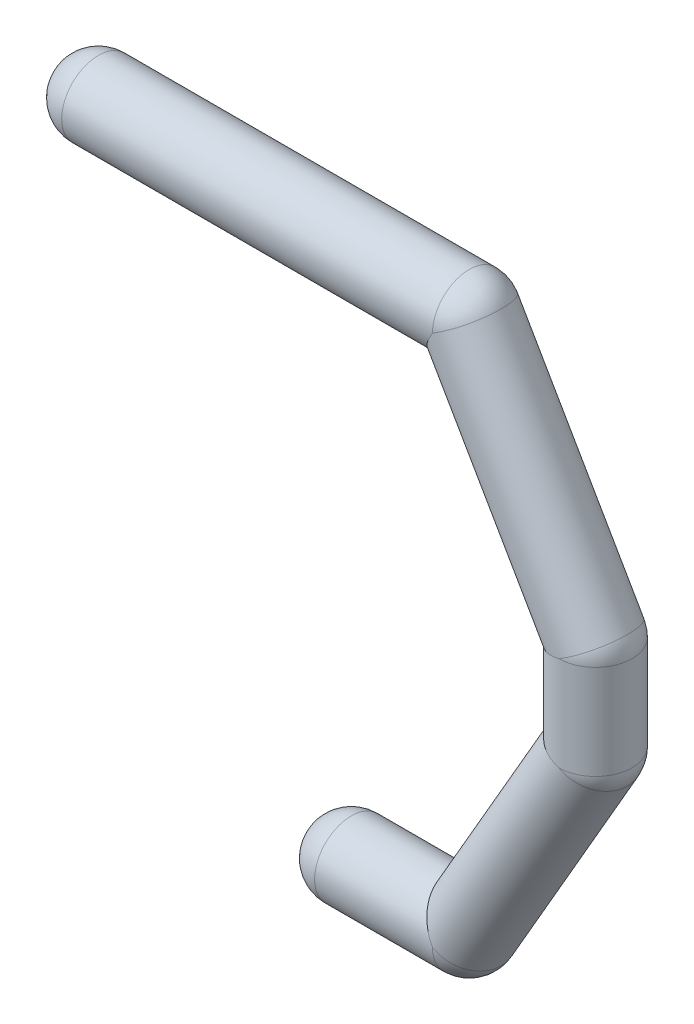
ISO-10303-21;
HEADER;
FILE_DESCRIPTION(('STEP AP214'),'2;1');
FILE_NAME('part.step','',(''),(''),'','','');
FILE_SCHEMA(('AUTOMOTIVE_DESIGN { 1 0 10303 214 1 1 1 1 }'));
ENDSEC;
DATA;
#1=APPLICATION_CONTEXT('core data for automotive mechanical design processes');
#2=APPLICATION_PROTOCOL_DEFINITION('international standard','automotive_design',2000,#1);
#3=PRODUCT_CONTEXT('',#1,'mechanical');
#4=PRODUCT('Part','Part','',(#3));
#5=PRODUCT_RELATED_PRODUCT_CATEGORY('part','',(#4));
#6=PRODUCT_DEFINITION_FORMATION('','',#4);
#7=PRODUCT_DEFINITION_CONTEXT('part definition',#1,'design');
#8=PRODUCT_DEFINITION('design','',#6,#7);
#9=PRODUCT_DEFINITION_SHAPE('','',#8);
#10=(LENGTH_UNIT() NAMED_UNIT(*) SI_UNIT(.MILLI.,.METRE.));
#11=(NAMED_UNIT(*) PLANE_ANGLE_UNIT() SI_UNIT($,.RADIAN.));
#12=(NAMED_UNIT(*) SI_UNIT($,.STERADIAN.) SOLID_ANGLE_UNIT());
#13=UNCERTAINTY_MEASURE_WITH_UNIT(LENGTH_MEASURE(1.E-05),#10,'distance_accuracy_value','');
#14=(GEOMETRIC_REPRESENTATION_CONTEXT(3) GLOBAL_UNCERTAINTY_ASSIGNED_CONTEXT((#13)) GLOBAL_UNIT_ASSIGNED_CONTEXT((#10,
#11,#12)) REPRESENTATION_CONTEXT('',''));
#15=CARTESIAN_POINT('',(0.,0.,0.));
#16=DIRECTION('',(0.,0.,1.));
#17=DIRECTION('',(1.,0.,0.));
#18=AXIS2_PLACEMENT_3D('',#15,#16,#17);
#19=CARTESIAN_POINT('',(20.395,-13.08,1.425));
#20=DIRECTION('',(1.,0.,0.));
#21=DIRECTION('',(0.,-1.,0.));
#22=AXIS2_PLACEMENT_3D('',#19,#20,#21);
#23=SPHERICAL_SURFACE('',#22,0.24);
#24=CARTESIAN_POINT('',(20.395,-13.08,1.425));
#25=DIRECTION('',(-1.,0.,0.));
#26=DIRECTION('',(0.,0.,1.));
#27=AXIS2_PLACEMENT_3D('',#24,#25,#26);
#28=CIRCLE('',#27,0.24);
#29=CARTESIAN_POINT('',(20.395,-13.08,1.665));
#30=VERTEX_POINT('',#29);
#31=EDGE_CURVE('E70',#30,#30,#28,.F.);
#32=ORIENTED_EDGE('',*,*,#31,.F.);
#33=EDGE_LOOP('',(#32));
#34=FACE_BOUND('',#33,.T.);
#35=ADVANCED_FACE('F63',(#34),#23,.T.);
#36=CARTESIAN_POINT('',(21.166,-13.08,1.425));
#37=DIRECTION('',(-1.,0.,0.));
#38=DIRECTION('',(0.,0.,1.));
#39=AXIS2_PLACEMENT_3D('',#36,#37,#38);
#40=CYLINDRICAL_SURFACE('',#39,0.24);
#41=CARTESIAN_POINT('',(21.166,-13.08,1.425));
#42=DIRECTION('',(-0.866000737383216,-0.50004272102664,0.));
#43=DIRECTION('',(-0.500042721026639,0.866000737383216,0.));
#44=AXIS2_PLACEMENT_3D('',#41,#42,#43);
#45=ELLIPSE('',#44,0.277136022684236,0.24);
#46=CARTESIAN_POINT('',(21.166,-13.08,1.185));
#47=VERTEX_POINT('',#46);
#48=CARTESIAN_POINT('',(21.166,-13.08,1.665));
#49=VERTEX_POINT('',#48);
#50=EDGE_CURVE('E12',#47,#49,#45,.F.);
#51=ORIENTED_EDGE('',*,*,#50,.F.);
#52=CARTESIAN_POINT('',(21.166,-13.08,1.425));
#53=DIRECTION('',(-1.,0.,0.));
#54=DIRECTION('',(0.,0.,1.));
#55=AXIS2_PLACEMENT_3D('',#52,#53,#54);
#56=CIRCLE('',#55,0.24);
#57=EDGE_CURVE('E77',#47,#49,#56,.T.);
#58=ORIENTED_EDGE('',*,*,#57,.T.);
#59=EDGE_LOOP('',(#51,#58));
#60=FACE_BOUND('',#59,.T.);
#61=ORIENTED_EDGE('',*,*,#31,.T.);
#62=EDGE_LOOP('',(#61));
#63=FACE_BOUND('',#62,.T.);
#64=ADVANCED_FACE('F137',(#60,#63),#40,.T.);
#65=CARTESIAN_POINT('',(21.166,-13.08,1.425));
#66=DIRECTION('',(1.,0.,0.));
#67=DIRECTION('',(0.,-1.,0.));
#68=AXIS2_PLACEMENT_3D('',#65,#66,#67);
#69=SPHERICAL_SURFACE('',#68,0.24);
#70=ORIENTED_EDGE('',*,*,#57,.F.);
#71=CARTESIAN_POINT('',(21.166,-13.08,1.425));
#72=DIRECTION('',(-0.499914554296549,-0.86607473026436,0.));
#73=DIRECTION('',(0.86607473026436,-0.499914554296549,0.));
#74=AXIS2_PLACEMENT_3D('',#71,#72,#73);
#75=CIRCLE('',#74,0.24);
#76=EDGE_CURVE('E128',#49,#47,#75,.F.);
#77=ORIENTED_EDGE('',*,*,#76,.F.);
#78=EDGE_LOOP('',(#70,#77));
#79=FACE_BOUND('',#78,.T.);
#80=ADVANCED_FACE('F143',(#79),#69,.T.);
#81=CARTESIAN_POINT('',(21.992,-11.649,1.425));
#82=DIRECTION('',(-0.499914554296549,-0.86607473026436,0.));
#83=DIRECTION('',(0.86607473026436,-0.499914554296549,0.));
#84=AXIS2_PLACEMENT_3D('',#81,#82,#83);
#85=CYLINDRICAL_SURFACE('',#84,0.24);
#86=CARTESIAN_POINT('',(21.992,-11.649,1.425));
#87=DIRECTION('',(-0.258771394995313,-0.965938592837132,0.));
#88=DIRECTION('',(-0.965938592837132,0.258771394995313,0.));
#89=AXIS2_PLACEMENT_3D('',#86,#87,#88);
#90=ELLIPSE('',#89,0.248462999387029,0.24);
#91=CARTESIAN_POINT('',(21.992,-11.649,1.185));
#92=VERTEX_POINT('',#91);
#93=CARTESIAN_POINT('',(21.992,-11.649,1.665));
#94=VERTEX_POINT('',#93);
#95=EDGE_CURVE('E131',#92,#94,#90,.F.);
#96=ORIENTED_EDGE('',*,*,#95,.F.);
#97=CARTESIAN_POINT('',(21.992,-11.649,1.425));
#98=DIRECTION('',(-0.499914554296552,-0.866074730264358,0.));
#99=DIRECTION('',(0.866074730264358,-0.499914554296552,0.));
#100=AXIS2_PLACEMENT_3D('',#97,#98,#99);
#101=CIRCLE('',#100,0.24);
#102=EDGE_CURVE('E126',#92,#94,#101,.T.);
#103=ORIENTED_EDGE('',*,*,#102,.T.);
#104=EDGE_LOOP('',(#96,#103));
#105=FACE_BOUND('',#104,.T.);
#106=ORIENTED_EDGE('',*,*,#76,.T.);
#107=ORIENTED_EDGE('',*,*,#50,.T.);
#108=EDGE_LOOP('',(#106,#107));
#109=FACE_BOUND('',#108,.T.);
#110=ADVANCED_FACE('F147',(#105,#109),#85,.T.);
#111=CARTESIAN_POINT('',(21.992,-11.649,1.425));
#112=DIRECTION('',(1.,0.,0.));
#113=DIRECTION('',(0.,-1.,0.));
#114=AXIS2_PLACEMENT_3D('',#111,#112,#113);
#115=SPHERICAL_SURFACE('',#114,0.24);
#116=ORIENTED_EDGE('',*,*,#102,.F.);
#117=CARTESIAN_POINT('',(21.992,-11.649,1.425));
#118=DIRECTION('',(0.,-1.,0.));
#119=DIRECTION('',(0.,0.,-1.));
#120=AXIS2_PLACEMENT_3D('',#117,#118,#119);
#121=CIRCLE('',#120,0.24);
#122=EDGE_CURVE('E116',#94,#92,#121,.F.);
#123=ORIENTED_EDGE('',*,*,#122,.F.);
#124=EDGE_LOOP('',(#116,#123));
#125=FACE_BOUND('',#124,.T.);
#126=ADVANCED_FACE('F153',(#125),#115,.T.);
#127=CARTESIAN_POINT('',(21.992,-11.031,1.425));
#128=DIRECTION('',(0.,-1.,0.));
#129=DIRECTION('',(0.,0.,-1.));
#130=AXIS2_PLACEMENT_3D('',#127,#128,#129);
#131=CYLINDRICAL_SURFACE('',#130,0.240000000000001);
#132=CARTESIAN_POINT('',(21.992,-11.031,1.425));
#133=DIRECTION('',(0.258771394995313,-0.965938592837133,0.));
#134=DIRECTION('',(-0.965938592837133,-0.258771394995312,0.));
#135=AXIS2_PLACEMENT_3D('',#132,#133,#134);
#136=ELLIPSE('',#135,0.248462999387029,0.24);
#137=CARTESIAN_POINT('',(21.992,-11.031,1.185));
#138=VERTEX_POINT('',#137);
#139=CARTESIAN_POINT('',(21.992,-11.031,1.665));
#140=VERTEX_POINT('',#139);
#141=EDGE_CURVE('E123',#138,#140,#136,.F.);
#142=ORIENTED_EDGE('',*,*,#141,.F.);
#143=CARTESIAN_POINT('',(21.992,-11.031,1.425));
#144=DIRECTION('',(0.,-1.,0.));
#145=DIRECTION('',(0.,0.,-1.));
#146=AXIS2_PLACEMENT_3D('',#143,#144,#145);
#147=CIRCLE('',#146,0.240000000000001);
#148=EDGE_CURVE('E114',#138,#140,#147,.T.);
#149=ORIENTED_EDGE('',*,*,#148,.T.);
#150=EDGE_LOOP('',(#142,#149));
#151=FACE_BOUND('',#150,.T.);
#152=ORIENTED_EDGE('',*,*,#122,.T.);
#153=ORIENTED_EDGE('',*,*,#95,.T.);
#154=EDGE_LOOP('',(#152,#153));
#155=FACE_BOUND('',#154,.T.);
#156=ADVANCED_FACE('F157',(#151,#155),#131,.T.);
#157=CARTESIAN_POINT('',(21.992,-11.031,1.425));
#158=DIRECTION('',(1.,0.,0.));
#159=DIRECTION('',(0.,-1.,0.));
#160=AXIS2_PLACEMENT_3D('',#157,#158,#159);
#161=SPHERICAL_SURFACE('',#160,0.24);
#162=ORIENTED_EDGE('',*,*,#148,.F.);
#163=CARTESIAN_POINT('',(21.992,-11.031,1.425));
#164=DIRECTION('',(0.499914554296548,-0.86607473026436,0.));
#165=DIRECTION('',(0.86607473026436,0.499914554296548,0.));
#166=AXIS2_PLACEMENT_3D('',#163,#164,#165);
#167=CIRCLE('',#166,0.24);
#168=EDGE_CURVE('E104',#140,#138,#167,.F.);
#169=ORIENTED_EDGE('',*,*,#168,.F.);
#170=EDGE_LOOP('',(#162,#169));
#171=FACE_BOUND('',#170,.T.);
#172=ADVANCED_FACE('F161',(#171),#161,.T.);
#173=CARTESIAN_POINT('',(21.166,-9.6,1.425));
#174=DIRECTION('',(0.499914554296548,-0.86607473026436,0.));
#175=DIRECTION('',(0.86607473026436,0.499914554296548,0.));
#176=AXIS2_PLACEMENT_3D('',#173,#174,#175);
#177=CYLINDRICAL_SURFACE('',#176,0.24);
#178=CARTESIAN_POINT('',(21.166,-9.6,1.425));
#179=DIRECTION('',(0.866000737383216,-0.50004272102664,0.));
#180=DIRECTION('',(-0.500042721026639,-0.866000737383216,0.));
#181=AXIS2_PLACEMENT_3D('',#178,#179,#180);
#182=ELLIPSE('',#181,0.277136022684236,0.24);
#183=CARTESIAN_POINT('',(21.166,-9.6,1.185));
#184=VERTEX_POINT('',#183);
#185=CARTESIAN_POINT('',(21.166,-9.6,1.665));
#186=VERTEX_POINT('',#185);
#187=EDGE_CURVE('E109',#184,#186,#182,.F.);
#188=ORIENTED_EDGE('',*,*,#187,.F.);
#189=CARTESIAN_POINT('',(21.166,-9.6,1.425));
#190=DIRECTION('',(0.499914554296551,-0.866074730264358,0.));
#191=DIRECTION('',(0.866074730264358,0.499914554296551,0.));
#192=AXIS2_PLACEMENT_3D('',#189,#190,#191);
#193=CIRCLE('',#192,0.24);
#194=EDGE_CURVE('E97',#184,#186,#193,.T.);
#195=ORIENTED_EDGE('',*,*,#194,.T.);
#196=EDGE_LOOP('',(#188,#195));
#197=FACE_BOUND('',#196,.T.);
#198=ORIENTED_EDGE('',*,*,#168,.T.);
#199=ORIENTED_EDGE('',*,*,#141,.T.);
#200=EDGE_LOOP('',(#198,#199));
#201=FACE_BOUND('',#200,.T.);
#202=ADVANCED_FACE('F112',(#197,#201),#177,.T.);
#203=CARTESIAN_POINT('',(21.166,-9.6,1.425));
#204=DIRECTION('',(1.,0.,0.));
#205=DIRECTION('',(0.,-1.,0.));
#206=AXIS2_PLACEMENT_3D('',#203,#204,#205);
#207=SPHERICAL_SURFACE('',#206,0.24);
#208=ORIENTED_EDGE('',*,*,#194,.F.);
#209=CARTESIAN_POINT('',(21.166,-9.6,1.425));
#210=DIRECTION('',(1.,0.,0.));
#211=DIRECTION('',(0.,0.,-1.));
#212=AXIS2_PLACEMENT_3D('',#209,#210,#211);
#213=CIRCLE('',#212,0.24);
#214=EDGE_CURVE('E100',#184,#186,#213,.T.);
#215=ORIENTED_EDGE('',*,*,#214,.T.);
#216=EDGE_LOOP('',(#208,#215));
#217=FACE_BOUND('',#216,.T.);
#218=ADVANCED_FACE('F99',(#217),#207,.T.);
#219=CARTESIAN_POINT('',(18.741,-9.6,1.425));
#220=DIRECTION('',(1.,0.,0.));
#221=DIRECTION('',(0.,0.,-1.));
#222=AXIS2_PLACEMENT_3D('',#219,#220,#221);
#223=CYLINDRICAL_SURFACE('',#222,0.24);
#224=ORIENTED_EDGE('',*,*,#214,.F.);
#225=ORIENTED_EDGE('',*,*,#187,.T.);
#226=EDGE_LOOP('',(#224,#225));
#227=FACE_BOUND('',#226,.T.);
#228=CARTESIAN_POINT('',(18.741,-9.6,1.425));
#229=DIRECTION('',(1.,0.,0.));
#230=DIRECTION('',(0.,0.,-1.));
#231=AXIS2_PLACEMENT_3D('',#228,#229,#230);
#232=CIRCLE('',#231,0.24);
#233=CARTESIAN_POINT('',(18.741,-9.6,1.185));
#234=VERTEX_POINT('',#233);
#235=EDGE_CURVE('E110',#234,#234,#232,.T.);
#236=ORIENTED_EDGE('',*,*,#235,.T.);
#237=EDGE_LOOP('',(#236));
#238=FACE_BOUND('',#237,.T.);
#239=ADVANCED_FACE('F107',(#227,#238),#223,.T.);
#240=CARTESIAN_POINT('',(18.741,-9.6,1.425));
#241=DIRECTION('',(1.,0.,0.));
#242=DIRECTION('',(0.,-1.,0.));
#243=AXIS2_PLACEMENT_3D('',#240,#241,#242);
#244=SPHERICAL_SURFACE('',#243,0.24);
#245=ORIENTED_EDGE('',*,*,#235,.F.);
#246=EDGE_LOOP('',(#245));
#247=FACE_BOUND('',#246,.T.);
#248=ADVANCED_FACE('F168',(#247),#244,.T.);
#249=CLOSED_SHELL('',(#35,#64,#80,#110,#126,#156,#172,#202,#218,#239,#248));
#250=MANIFOLD_SOLID_BREP('B2',#249);
#251=ADVANCED_BREP_SHAPE_REPRESENTATION('',(#18,#250),#14);
#252=SHAPE_DEFINITION_REPRESENTATION(#9,#251);
ENDSEC;
END-ISO-10303-21;
